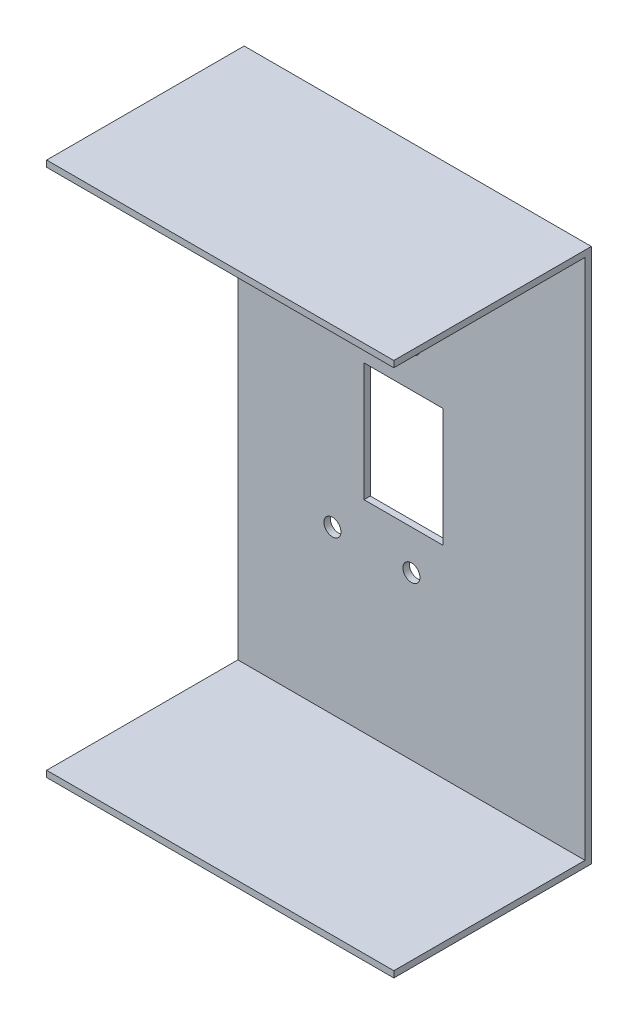
ISO-10303-21;
HEADER;
FILE_DESCRIPTION(('STEP AP214'),'2;1');
FILE_NAME('part.step','',(''),(''),'','','');
FILE_SCHEMA(('AUTOMOTIVE_DESIGN { 1 0 10303 214 1 1 1 1 }'));
ENDSEC;
DATA;
#1=APPLICATION_CONTEXT('core data for automotive mechanical design processes');
#2=APPLICATION_PROTOCOL_DEFINITION('international standard','automotive_design',2000,#1);
#3=PRODUCT_CONTEXT('',#1,'mechanical');
#4=PRODUCT('Part','Part','',(#3));
#5=PRODUCT_RELATED_PRODUCT_CATEGORY('part','',(#4));
#6=PRODUCT_DEFINITION_FORMATION('','',#4);
#7=PRODUCT_DEFINITION_CONTEXT('part definition',#1,'design');
#8=PRODUCT_DEFINITION('design','',#6,#7);
#9=PRODUCT_DEFINITION_SHAPE('','',#8);
#10=(LENGTH_UNIT() NAMED_UNIT(*) SI_UNIT(.MILLI.,.METRE.));
#11=(NAMED_UNIT(*) PLANE_ANGLE_UNIT() SI_UNIT($,.RADIAN.));
#12=(NAMED_UNIT(*) SI_UNIT($,.STERADIAN.) SOLID_ANGLE_UNIT());
#13=UNCERTAINTY_MEASURE_WITH_UNIT(LENGTH_MEASURE(1.E-05),#10,'distance_accuracy_value','');
#14=(GEOMETRIC_REPRESENTATION_CONTEXT(3) GLOBAL_UNCERTAINTY_ASSIGNED_CONTEXT((#13)) GLOBAL_UNIT_ASSIGNED_CONTEXT((#10,
#11,#12)) REPRESENTATION_CONTEXT('',''));
#15=CARTESIAN_POINT('',(0.,0.,0.));
#16=DIRECTION('',(0.,0.,1.));
#17=DIRECTION('',(1.,0.,0.));
#18=AXIS2_PLACEMENT_3D('',#15,#16,#17);
#19=CARTESIAN_POINT('',(87.89068,0.,-50.));
#20=DIRECTION('',(0.,-1.,0.));
#21=DIRECTION('',(0.,0.,-1.));
#22=AXIS2_PLACEMENT_3D('',#19,#20,#21);
#23=PLANE('',#22);
#24=DIRECTION('',(0.,0.,1.));
#25=VECTOR('',#24,1.);
#26=CARTESIAN_POINT('',(0.,0.,-50.));
#27=LINE('',#26,#25);
#28=CARTESIAN_POINT('',(0.,0.,-50.));
#29=VERTEX_POINT('',#28);
#30=CARTESIAN_POINT('',(0.,0.,0.));
#31=VERTEX_POINT('',#30);
#32=EDGE_CURVE('E170',#29,#31,#27,.T.);
#33=ORIENTED_EDGE('',*,*,#32,.T.);
#34=DIRECTION('',(-1.,0.,0.));
#35=VECTOR('',#34,1.);
#36=CARTESIAN_POINT('',(87.89068,0.,0.));
#37=LINE('',#36,#35);
#38=CARTESIAN_POINT('',(87.89068,0.,0.));
#39=VERTEX_POINT('',#38);
#40=EDGE_CURVE('E11',#39,#31,#37,.T.);
#41=ORIENTED_EDGE('',*,*,#40,.F.);
#42=DIRECTION('',(0.,0.,1.));
#43=VECTOR('',#42,1.);
#44=CARTESIAN_POINT('',(87.89068,0.,-50.));
#45=LINE('',#44,#43);
#46=CARTESIAN_POINT('',(87.89068,0.,-50.));
#47=VERTEX_POINT('',#46);
#48=EDGE_CURVE('E172',#47,#39,#45,.T.);
#49=ORIENTED_EDGE('',*,*,#48,.F.);
#50=DIRECTION('',(-1.,0.,0.));
#51=VECTOR('',#50,1.);
#52=CARTESIAN_POINT('',(87.89068,0.,-50.));
#53=LINE('',#52,#51);
#54=EDGE_CURVE('E198',#47,#29,#53,.T.);
#55=ORIENTED_EDGE('',*,*,#54,.T.);
#56=EDGE_LOOP('',(#33,#41,#49,#55));
#57=FACE_BOUND('',#56,.T.);
#58=ADVANCED_FACE('F43',(#57),#23,.F.);
#59=CARTESIAN_POINT('',(87.89068,0.,0.));
#60=DIRECTION('',(0.,0.,-1.));
#61=DIRECTION('',(0.,1.,0.));
#62=AXIS2_PLACEMENT_3D('',#59,#60,#61);
#63=PLANE('',#62);
#64=DIRECTION('',(0.,-1.,0.));
#65=VECTOR('',#64,1.);
#66=CARTESIAN_POINT('',(0.,0.,0.));
#67=LINE('',#66,#65);
#68=CARTESIAN_POINT('',(0.,-1.6002,0.));
#69=VERTEX_POINT('',#68);
#70=EDGE_CURVE('E202',#31,#69,#67,.T.);
#71=ORIENTED_EDGE('',*,*,#70,.T.);
#72=DIRECTION('',(-1.,0.,0.));
#73=VECTOR('',#72,1.);
#74=CARTESIAN_POINT('',(87.89068,-1.6002,0.));
#75=LINE('',#74,#73);
#76=CARTESIAN_POINT('',(87.89068,-1.6002,0.));
#77=VERTEX_POINT('',#76);
#78=EDGE_CURVE('E51',#77,#69,#75,.T.);
#79=ORIENTED_EDGE('',*,*,#78,.F.);
#80=DIRECTION('',(0.,-1.,0.));
#81=VECTOR('',#80,1.);
#82=CARTESIAN_POINT('',(87.89068,0.,0.));
#83=LINE('',#82,#81);
#84=EDGE_CURVE('E176',#39,#77,#83,.T.);
#85=ORIENTED_EDGE('',*,*,#84,.F.);
#86=ORIENTED_EDGE('',*,*,#40,.T.);
#87=EDGE_LOOP('',(#71,#79,#85,#86));
#88=FACE_BOUND('',#87,.T.);
#89=ADVANCED_FACE('F271',(#88),#63,.F.);
#90=CARTESIAN_POINT('',(87.89068,-1.6002,0.));
#91=DIRECTION('',(0.,1.,0.));
#92=DIRECTION('',(0.,0.,1.));
#93=AXIS2_PLACEMENT_3D('',#90,#91,#92);
#94=PLANE('',#93);
#95=DIRECTION('',(0.,0.,-1.));
#96=VECTOR('',#95,1.);
#97=CARTESIAN_POINT('',(0.,-1.6002,0.));
#98=LINE('',#97,#96);
#99=CARTESIAN_POINT('',(0.,-1.6002,-48.3998));
#100=VERTEX_POINT('',#99);
#101=EDGE_CURVE('E205',#69,#100,#98,.T.);
#102=ORIENTED_EDGE('',*,*,#101,.T.);
#103=DIRECTION('',(-1.,0.,0.));
#104=VECTOR('',#103,1.);
#105=CARTESIAN_POINT('',(87.89068,-1.6002,-48.3998));
#106=LINE('',#105,#104);
#107=CARTESIAN_POINT('',(87.89068,-1.6002,-48.3998));
#108=VERTEX_POINT('',#107);
#109=EDGE_CURVE('E241',#108,#100,#106,.T.);
#110=ORIENTED_EDGE('',*,*,#109,.F.);
#111=DIRECTION('',(0.,0.,-1.));
#112=VECTOR('',#111,1.);
#113=CARTESIAN_POINT('',(87.89068,-1.6002,0.));
#114=LINE('',#113,#112);
#115=EDGE_CURVE('E180',#77,#108,#114,.T.);
#116=ORIENTED_EDGE('',*,*,#115,.F.);
#117=ORIENTED_EDGE('',*,*,#78,.T.);
#118=EDGE_LOOP('',(#102,#110,#116,#117));
#119=FACE_BOUND('',#118,.T.);
#120=ADVANCED_FACE('F250',(#119),#94,.F.);
#121=CARTESIAN_POINT('',(87.89068,-1.6002,-48.3998));
#122=DIRECTION('',(0.,0.,-1.));
#123=DIRECTION('',(0.,1.,0.));
#124=AXIS2_PLACEMENT_3D('',#121,#122,#123);
#125=PLANE('',#124);
#126=CARTESIAN_POINT('',(43.94534,-42.69395,-48.3998));
#127=DIRECTION('',(0.,0.,1.));
#128=DIRECTION('',(1.,0.,0.));
#129=AXIS2_PLACEMENT_3D('',#126,#127,#128);
#130=CIRCLE('',#129,2.155);
#131=CARTESIAN_POINT('',(46.10034,-42.69395,-48.3998));
#132=VERTEX_POINT('',#131);
#133=EDGE_CURVE('E309',#132,#132,#130,.T.);
#134=ORIENTED_EDGE('',*,*,#133,.F.);
#135=EDGE_LOOP('',(#134));
#136=FACE_BOUND('',#135,.T.);
#137=CARTESIAN_POINT('',(43.94534,-92.69395,-48.3998));
#138=DIRECTION('',(0.,0.,1.));
#139=DIRECTION('',(1.,0.,0.));
#140=AXIS2_PLACEMENT_3D('',#137,#138,#139);
#141=CIRCLE('',#140,2.15499999999999);
#142=CARTESIAN_POINT('',(46.10034,-92.69395,-48.3998));
#143=VERTEX_POINT('',#142);
#144=EDGE_CURVE('E313',#143,#143,#141,.T.);
#145=ORIENTED_EDGE('',*,*,#144,.F.);
#146=EDGE_LOOP('',(#145));
#147=FACE_BOUND('',#146,.T.);
#148=CARTESIAN_POINT('',(23.94534,-42.69395,-48.3998));
#149=DIRECTION('',(0.,0.,1.));
#150=DIRECTION('',(1.,0.,0.));
#151=AXIS2_PLACEMENT_3D('',#148,#149,#150);
#152=CIRCLE('',#151,2.155);
#153=CARTESIAN_POINT('',(26.10034,-42.69395,-48.3998));
#154=VERTEX_POINT('',#153);
#155=EDGE_CURVE('E317',#154,#154,#152,.T.);
#156=ORIENTED_EDGE('',*,*,#155,.F.);
#157=EDGE_LOOP('',(#156));
#158=FACE_BOUND('',#157,.T.);
#159=CARTESIAN_POINT('',(23.94534,-92.69395,-48.3998));
#160=DIRECTION('',(0.,0.,1.));
#161=DIRECTION('',(1.,0.,0.));
#162=AXIS2_PLACEMENT_3D('',#159,#160,#161);
#163=CIRCLE('',#162,2.15499999999999);
#164=CARTESIAN_POINT('',(26.10034,-92.69395,-48.3998));
#165=VERTEX_POINT('',#164);
#166=EDGE_CURVE('E320',#165,#165,#163,.T.);
#167=ORIENTED_EDGE('',*,*,#166,.F.);
#168=EDGE_LOOP('',(#167));
#169=FACE_BOUND('',#168,.T.);
#170=DIRECTION('',(1.,0.,0.));
#171=VECTOR('',#170,1.);
#172=CARTESIAN_POINT('',(31.94534,-82.69395,-48.3998));
#173=LINE('',#172,#171);
#174=CARTESIAN_POINT('',(31.94534,-82.69395,-48.3998));
#175=VERTEX_POINT('',#174);
#176=CARTESIAN_POINT('',(51.94534,-82.69395,-48.3998));
#177=VERTEX_POINT('',#176);
#178=EDGE_CURVE('E145',#175,#177,#173,.T.);
#179=ORIENTED_EDGE('',*,*,#178,.F.);
#180=DIRECTION('',(0.,-1.,0.));
#181=VECTOR('',#180,1.);
#182=CARTESIAN_POINT('',(31.94534,-82.69395,-48.3998));
#183=LINE('',#182,#181);
#184=CARTESIAN_POINT('',(31.94534,-52.69395,-48.3998));
#185=VERTEX_POINT('',#184);
#186=EDGE_CURVE('E58',#185,#175,#183,.T.);
#187=ORIENTED_EDGE('',*,*,#186,.F.);
#188=DIRECTION('',(-1.,0.,0.));
#189=VECTOR('',#188,1.);
#190=CARTESIAN_POINT('',(31.94534,-52.69395,-48.3998));
#191=LINE('',#190,#189);
#192=CARTESIAN_POINT('',(51.94534,-52.69395,-48.3998));
#193=VERTEX_POINT('',#192);
#194=EDGE_CURVE('E153',#193,#185,#191,.T.);
#195=ORIENTED_EDGE('',*,*,#194,.F.);
#196=DIRECTION('',(0.,1.,0.));
#197=VECTOR('',#196,1.);
#198=CARTESIAN_POINT('',(51.94534,-82.69395,-48.3998));
#199=LINE('',#198,#197);
#200=EDGE_CURVE('E135',#177,#193,#199,.T.);
#201=ORIENTED_EDGE('',*,*,#200,.F.);
#202=EDGE_LOOP('',(#179,#187,#195,#201));
#203=FACE_BOUND('',#202,.T.);
#204=DIRECTION('',(0.,-1.,0.));
#205=VECTOR('',#204,1.);
#206=CARTESIAN_POINT('',(0.,-1.6002,-48.3998));
#207=LINE('',#206,#205);
#208=CARTESIAN_POINT('',(0.,-133.7877,-48.3998));
#209=VERTEX_POINT('',#208);
#210=EDGE_CURVE('E208',#100,#209,#207,.T.);
#211=ORIENTED_EDGE('',*,*,#210,.T.);
#212=DIRECTION('',(-1.,0.,0.));
#213=VECTOR('',#212,1.);
#214=CARTESIAN_POINT('',(87.89068,-133.7877,-48.3998));
#215=LINE('',#214,#213);
#216=CARTESIAN_POINT('',(87.89068,-133.7877,-48.3998));
#217=VERTEX_POINT('',#216);
#218=EDGE_CURVE('E237',#217,#209,#215,.T.);
#219=ORIENTED_EDGE('',*,*,#218,.F.);
#220=DIRECTION('',(0.,-1.,0.));
#221=VECTOR('',#220,1.);
#222=CARTESIAN_POINT('',(87.89068,-1.6002,-48.3998));
#223=LINE('',#222,#221);
#224=EDGE_CURVE('E183',#108,#217,#223,.T.);
#225=ORIENTED_EDGE('',*,*,#224,.F.);
#226=ORIENTED_EDGE('',*,*,#109,.T.);
#227=EDGE_LOOP('',(#211,#219,#225,#226));
#228=FACE_BOUND('',#227,.T.);
#229=ADVANCED_FACE('F150',(#136,#147,#158,#169,#203,#228),#125,.F.);
#230=CARTESIAN_POINT('',(87.89068,-133.7877,-48.3998));
#231=DIRECTION('',(0.,-1.,0.));
#232=DIRECTION('',(0.,0.,-1.));
#233=AXIS2_PLACEMENT_3D('',#230,#231,#232);
#234=PLANE('',#233);
#235=DIRECTION('',(0.,0.,1.));
#236=VECTOR('',#235,1.);
#237=CARTESIAN_POINT('',(0.,-133.7877,-48.3998));
#238=LINE('',#237,#236);
#239=CARTESIAN_POINT('',(0.,-133.7877,0.));
#240=VERTEX_POINT('',#239);
#241=EDGE_CURVE('E211',#209,#240,#238,.T.);
#242=ORIENTED_EDGE('',*,*,#241,.T.);
#243=DIRECTION('',(-1.,0.,0.));
#244=VECTOR('',#243,1.);
#245=CARTESIAN_POINT('',(87.89068,-133.7877,0.));
#246=LINE('',#245,#244);
#247=CARTESIAN_POINT('',(87.89068,-133.7877,0.));
#248=VERTEX_POINT('',#247);
#249=EDGE_CURVE('E233',#248,#240,#246,.T.);
#250=ORIENTED_EDGE('',*,*,#249,.F.);
#251=DIRECTION('',(0.,0.,1.));
#252=VECTOR('',#251,1.);
#253=CARTESIAN_POINT('',(87.89068,-133.7877,-48.3998));
#254=LINE('',#253,#252);
#255=EDGE_CURVE('E186',#217,#248,#254,.T.);
#256=ORIENTED_EDGE('',*,*,#255,.F.);
#257=ORIENTED_EDGE('',*,*,#218,.T.);
#258=EDGE_LOOP('',(#242,#250,#256,#257));
#259=FACE_BOUND('',#258,.T.);
#260=ADVANCED_FACE('F263',(#259),#234,.F.);
#261=CARTESIAN_POINT('',(87.89068,-133.7877,0.));
#262=DIRECTION('',(0.,0.,-1.));
#263=DIRECTION('',(0.,1.,0.));
#264=AXIS2_PLACEMENT_3D('',#261,#262,#263);
#265=PLANE('',#264);
#266=DIRECTION('',(0.,-1.,0.));
#267=VECTOR('',#266,1.);
#268=CARTESIAN_POINT('',(0.,-133.7877,0.));
#269=LINE('',#268,#267);
#270=CARTESIAN_POINT('',(0.,-135.3879,0.));
#271=VERTEX_POINT('',#270);
#272=EDGE_CURVE('E214',#240,#271,#269,.T.);
#273=ORIENTED_EDGE('',*,*,#272,.T.);
#274=DIRECTION('',(-1.,0.,0.));
#275=VECTOR('',#274,1.);
#276=CARTESIAN_POINT('',(87.89068,-135.3879,0.));
#277=LINE('',#276,#275);
#278=CARTESIAN_POINT('',(87.89068,-135.3879,0.));
#279=VERTEX_POINT('',#278);
#280=EDGE_CURVE('E229',#279,#271,#277,.T.);
#281=ORIENTED_EDGE('',*,*,#280,.F.);
#282=DIRECTION('',(0.,-1.,0.));
#283=VECTOR('',#282,1.);
#284=CARTESIAN_POINT('',(87.89068,-133.7877,0.));
#285=LINE('',#284,#283);
#286=EDGE_CURVE('E189',#248,#279,#285,.T.);
#287=ORIENTED_EDGE('',*,*,#286,.F.);
#288=ORIENTED_EDGE('',*,*,#249,.T.);
#289=EDGE_LOOP('',(#273,#281,#287,#288));
#290=FACE_BOUND('',#289,.T.);
#291=ADVANCED_FACE('F284',(#290),#265,.F.);
#292=CARTESIAN_POINT('',(87.89068,-135.3879,0.));
#293=DIRECTION('',(0.,1.,0.));
#294=DIRECTION('',(0.,0.,1.));
#295=AXIS2_PLACEMENT_3D('',#292,#293,#294);
#296=PLANE('',#295);
#297=DIRECTION('',(0.,0.,-1.));
#298=VECTOR('',#297,1.);
#299=CARTESIAN_POINT('',(0.,-135.3879,0.));
#300=LINE('',#299,#298);
#301=CARTESIAN_POINT('',(0.,-135.3879,-50.));
#302=VERTEX_POINT('',#301);
#303=EDGE_CURVE('E217',#271,#302,#300,.T.);
#304=ORIENTED_EDGE('',*,*,#303,.T.);
#305=DIRECTION('',(-1.,0.,0.));
#306=VECTOR('',#305,1.);
#307=CARTESIAN_POINT('',(87.89068,-135.3879,-50.));
#308=LINE('',#307,#306);
#309=CARTESIAN_POINT('',(87.89068,-135.3879,-50.));
#310=VERTEX_POINT('',#309);
#311=EDGE_CURVE('E225',#310,#302,#308,.T.);
#312=ORIENTED_EDGE('',*,*,#311,.F.);
#313=DIRECTION('',(0.,0.,-1.));
#314=VECTOR('',#313,1.);
#315=CARTESIAN_POINT('',(87.89068,-135.3879,0.));
#316=LINE('',#315,#314);
#317=EDGE_CURVE('E192',#279,#310,#316,.T.);
#318=ORIENTED_EDGE('',*,*,#317,.F.);
#319=ORIENTED_EDGE('',*,*,#280,.T.);
#320=EDGE_LOOP('',(#304,#312,#318,#319));
#321=FACE_BOUND('',#320,.T.);
#322=ADVANCED_FACE('F282',(#321),#296,.F.);
#323=CARTESIAN_POINT('',(87.89068,-135.3879,-50.));
#324=DIRECTION('',(0.,0.,1.));
#325=DIRECTION('',(1.,0.,0.));
#326=AXIS2_PLACEMENT_3D('',#323,#324,#325);
#327=PLANE('',#326);
#328=CARTESIAN_POINT('',(43.94534,-42.69395,-50.));
#329=DIRECTION('',(0.,0.,1.));
#330=DIRECTION('',(1.,0.,0.));
#331=AXIS2_PLACEMENT_3D('',#328,#329,#330);
#332=CIRCLE('',#331,2.155);
#333=CARTESIAN_POINT('',(46.10034,-42.69395,-50.));
#334=VERTEX_POINT('',#333);
#335=EDGE_CURVE('E342',#334,#334,#332,.F.);
#336=ORIENTED_EDGE('',*,*,#335,.F.);
#337=EDGE_LOOP('',(#336));
#338=FACE_BOUND('',#337,.T.);
#339=CARTESIAN_POINT('',(43.94534,-92.69395,-50.));
#340=DIRECTION('',(0.,0.,1.));
#341=DIRECTION('',(1.,0.,0.));
#342=AXIS2_PLACEMENT_3D('',#339,#340,#341);
#343=CIRCLE('',#342,2.15499999999999);
#344=CARTESIAN_POINT('',(46.10034,-92.69395,-50.));
#345=VERTEX_POINT('',#344);
#346=EDGE_CURVE('E336',#345,#345,#343,.F.);
#347=ORIENTED_EDGE('',*,*,#346,.F.);
#348=EDGE_LOOP('',(#347));
#349=FACE_BOUND('',#348,.T.);
#350=CARTESIAN_POINT('',(23.94534,-42.69395,-50.));
#351=DIRECTION('',(0.,0.,1.));
#352=DIRECTION('',(1.,0.,0.));
#353=AXIS2_PLACEMENT_3D('',#350,#351,#352);
#354=CIRCLE('',#353,2.155);
#355=CARTESIAN_POINT('',(26.10034,-42.69395,-50.));
#356=VERTEX_POINT('',#355);
#357=EDGE_CURVE('E330',#356,#356,#354,.F.);
#358=ORIENTED_EDGE('',*,*,#357,.F.);
#359=EDGE_LOOP('',(#358));
#360=FACE_BOUND('',#359,.T.);
#361=CARTESIAN_POINT('',(23.94534,-92.69395,-50.));
#362=DIRECTION('',(0.,0.,1.));
#363=DIRECTION('',(1.,0.,0.));
#364=AXIS2_PLACEMENT_3D('',#361,#362,#363);
#365=CIRCLE('',#364,2.15499999999999);
#366=CARTESIAN_POINT('',(26.10034,-92.69395,-50.));
#367=VERTEX_POINT('',#366);
#368=EDGE_CURVE('E323',#367,#367,#365,.F.);
#369=ORIENTED_EDGE('',*,*,#368,.F.);
#370=EDGE_LOOP('',(#369));
#371=FACE_BOUND('',#370,.T.);
#372=DIRECTION('',(1.,0.,0.));
#373=VECTOR('',#372,1.);
#374=CARTESIAN_POINT('',(31.94534,-52.69395,-50.));
#375=LINE('',#374,#373);
#376=CARTESIAN_POINT('',(31.94534,-52.69395,-50.));
#377=VERTEX_POINT('',#376);
#378=CARTESIAN_POINT('',(51.94534,-52.69395,-50.));
#379=VERTEX_POINT('',#378);
#380=EDGE_CURVE('E350',#377,#379,#375,.T.);
#381=ORIENTED_EDGE('',*,*,#380,.F.);
#382=DIRECTION('',(0.,1.,0.));
#383=VECTOR('',#382,1.);
#384=CARTESIAN_POINT('',(31.94534,-82.69395,-50.));
#385=LINE('',#384,#383);
#386=CARTESIAN_POINT('',(31.94534,-82.69395,-50.));
#387=VERTEX_POINT('',#386);
#388=EDGE_CURVE('E171',#387,#377,#385,.T.);
#389=ORIENTED_EDGE('',*,*,#388,.F.);
#390=DIRECTION('',(-1.,0.,0.));
#391=VECTOR('',#390,1.);
#392=CARTESIAN_POINT('',(31.94534,-82.69395,-50.));
#393=LINE('',#392,#391);
#394=CARTESIAN_POINT('',(51.94534,-82.69395,-50.));
#395=VERTEX_POINT('',#394);
#396=EDGE_CURVE('E167',#395,#387,#393,.T.);
#397=ORIENTED_EDGE('',*,*,#396,.F.);
#398=DIRECTION('',(0.,-1.,0.));
#399=VECTOR('',#398,1.);
#400=CARTESIAN_POINT('',(51.94534,-82.69395,-50.));
#401=LINE('',#400,#399);
#402=EDGE_CURVE('E138',#379,#395,#401,.T.);
#403=ORIENTED_EDGE('',*,*,#402,.F.);
#404=EDGE_LOOP('',(#381,#389,#397,#403));
#405=FACE_BOUND('',#404,.T.);
#406=DIRECTION('',(0.,1.,0.));
#407=VECTOR('',#406,1.);
#408=CARTESIAN_POINT('',(0.,-135.3879,-50.));
#409=LINE('',#408,#407);
#410=EDGE_CURVE('E177',#302,#29,#409,.T.);
#411=ORIENTED_EDGE('',*,*,#410,.T.);
#412=ORIENTED_EDGE('',*,*,#54,.F.);
#413=DIRECTION('',(0.,1.,0.));
#414=VECTOR('',#413,1.);
#415=CARTESIAN_POINT('',(87.89068,-135.3879,-50.));
#416=LINE('',#415,#414);
#417=EDGE_CURVE('E195',#310,#47,#416,.T.);
#418=ORIENTED_EDGE('',*,*,#417,.F.);
#419=ORIENTED_EDGE('',*,*,#311,.T.);
#420=EDGE_LOOP('',(#411,#412,#418,#419));
#421=FACE_BOUND('',#420,.T.);
#422=ADVANCED_FACE('F277',(#338,#349,#360,#371,#405,#421),#327,.F.);
#423=CARTESIAN_POINT('',(87.89068,0.,0.));
#424=DIRECTION('',(1.,0.,0.));
#425=DIRECTION('',(0.,0.,-1.));
#426=AXIS2_PLACEMENT_3D('',#423,#424,#425);
#427=PLANE('',#426);
#428=ORIENTED_EDGE('',*,*,#48,.T.);
#429=ORIENTED_EDGE('',*,*,#84,.T.);
#430=ORIENTED_EDGE('',*,*,#115,.T.);
#431=ORIENTED_EDGE('',*,*,#224,.T.);
#432=ORIENTED_EDGE('',*,*,#255,.T.);
#433=ORIENTED_EDGE('',*,*,#286,.T.);
#434=ORIENTED_EDGE('',*,*,#317,.T.);
#435=ORIENTED_EDGE('',*,*,#417,.T.);
#436=EDGE_LOOP('',(#428,#429,#430,#431,#432,#433,#434,#435));
#437=FACE_BOUND('',#436,.T.);
#438=ADVANCED_FACE('F267',(#437),#427,.T.);
#439=CARTESIAN_POINT('',(0.,0.,0.));
#440=DIRECTION('',(1.,0.,0.));
#441=DIRECTION('',(0.,0.,-1.));
#442=AXIS2_PLACEMENT_3D('',#439,#440,#441);
#443=PLANE('',#442);
#444=ORIENTED_EDGE('',*,*,#32,.F.);
#445=ORIENTED_EDGE('',*,*,#410,.F.);
#446=ORIENTED_EDGE('',*,*,#303,.F.);
#447=ORIENTED_EDGE('',*,*,#272,.F.);
#448=ORIENTED_EDGE('',*,*,#241,.F.);
#449=ORIENTED_EDGE('',*,*,#210,.F.);
#450=ORIENTED_EDGE('',*,*,#101,.F.);
#451=ORIENTED_EDGE('',*,*,#70,.F.);
#452=EDGE_LOOP('',(#444,#445,#446,#447,#448,#449,#450,#451));
#453=FACE_BOUND('',#452,.T.);
#454=ADVANCED_FACE('F256',(#453),#443,.F.);
#455=CARTESIAN_POINT('',(31.94534,-82.69395,-86.0555127546399));
#456=DIRECTION('',(-1.,0.,0.));
#457=DIRECTION('',(0.,0.,1.));
#458=AXIS2_PLACEMENT_3D('',#455,#456,#457);
#459=PLANE('',#458);
#460=ORIENTED_EDGE('',*,*,#388,.T.);
#461=DIRECTION('',(0.,0.,1.));
#462=VECTOR('',#461,1.);
#463=CARTESIAN_POINT('',(31.94534,-52.69395,-86.0555127546399));
#464=LINE('',#463,#462);
#465=EDGE_CURVE('E160',#377,#185,#464,.T.);
#466=ORIENTED_EDGE('',*,*,#465,.T.);
#467=ORIENTED_EDGE('',*,*,#186,.T.);
#468=DIRECTION('',(0.,0.,1.));
#469=VECTOR('',#468,1.);
#470=CARTESIAN_POINT('',(31.94534,-82.69395,-86.0555127546399));
#471=LINE('',#470,#469);
#472=EDGE_CURVE('E142',#387,#175,#471,.T.);
#473=ORIENTED_EDGE('',*,*,#472,.F.);
#474=EDGE_LOOP('',(#460,#466,#467,#473));
#475=FACE_BOUND('',#474,.T.);
#476=ADVANCED_FACE('F356',(#475),#459,.F.);
#477=CARTESIAN_POINT('',(31.94534,-52.69395,-86.0555127546399));
#478=DIRECTION('',(0.,1.,0.));
#479=DIRECTION('',(0.,0.,1.));
#480=AXIS2_PLACEMENT_3D('',#477,#478,#479);
#481=PLANE('',#480);
#482=ORIENTED_EDGE('',*,*,#380,.T.);
#483=DIRECTION('',(0.,0.,1.));
#484=VECTOR('',#483,1.);
#485=CARTESIAN_POINT('',(51.94534,-52.69395,-86.0555127546399));
#486=LINE('',#485,#484);
#487=EDGE_CURVE('E141',#379,#193,#486,.T.);
#488=ORIENTED_EDGE('',*,*,#487,.T.);
#489=ORIENTED_EDGE('',*,*,#194,.T.);
#490=ORIENTED_EDGE('',*,*,#465,.F.);
#491=EDGE_LOOP('',(#482,#488,#489,#490));
#492=FACE_BOUND('',#491,.T.);
#493=ADVANCED_FACE('F360',(#492),#481,.F.);
#494=CARTESIAN_POINT('',(51.94534,-82.69395,-86.0555127546399));
#495=DIRECTION('',(1.,0.,0.));
#496=DIRECTION('',(0.,0.,-1.));
#497=AXIS2_PLACEMENT_3D('',#494,#495,#496);
#498=PLANE('',#497);
#499=ORIENTED_EDGE('',*,*,#402,.T.);
#500=DIRECTION('',(0.,0.,1.));
#501=VECTOR('',#500,1.);
#502=CARTESIAN_POINT('',(51.94534,-82.69395,-86.0555127546399));
#503=LINE('',#502,#501);
#504=EDGE_CURVE('E66',#395,#177,#503,.T.);
#505=ORIENTED_EDGE('',*,*,#504,.T.);
#506=ORIENTED_EDGE('',*,*,#200,.T.);
#507=ORIENTED_EDGE('',*,*,#487,.F.);
#508=EDGE_LOOP('',(#499,#505,#506,#507));
#509=FACE_BOUND('',#508,.T.);
#510=ADVANCED_FACE('F132',(#509),#498,.F.);
#511=CARTESIAN_POINT('',(31.94534,-82.69395,-86.0555127546399));
#512=DIRECTION('',(0.,-1.,0.));
#513=DIRECTION('',(0.,0.,-1.));
#514=AXIS2_PLACEMENT_3D('',#511,#512,#513);
#515=PLANE('',#514);
#516=ORIENTED_EDGE('',*,*,#396,.T.);
#517=ORIENTED_EDGE('',*,*,#472,.T.);
#518=ORIENTED_EDGE('',*,*,#178,.T.);
#519=ORIENTED_EDGE('',*,*,#504,.F.);
#520=EDGE_LOOP('',(#516,#517,#518,#519));
#521=FACE_BOUND('',#520,.T.);
#522=ADVANCED_FACE('F146',(#521),#515,.F.);
#523=CARTESIAN_POINT('',(23.94534,-92.69395,-86.0555127546399));
#524=DIRECTION('',(0.,0.,1.));
#525=DIRECTION('',(1.,0.,0.));
#526=AXIS2_PLACEMENT_3D('',#523,#524,#525);
#527=CYLINDRICAL_SURFACE('',#526,2.15499999999999);
#528=ORIENTED_EDGE('',*,*,#368,.T.);
#529=EDGE_LOOP('',(#528));
#530=FACE_BOUND('',#529,.T.);
#531=ORIENTED_EDGE('',*,*,#166,.T.);
#532=EDGE_LOOP('',(#531));
#533=FACE_BOUND('',#532,.T.);
#534=ADVANCED_FACE('F377',(#530,#533),#527,.F.);
#535=CARTESIAN_POINT('',(23.94534,-42.69395,-86.0555127546399));
#536=DIRECTION('',(0.,0.,1.));
#537=DIRECTION('',(1.,0.,0.));
#538=AXIS2_PLACEMENT_3D('',#535,#536,#537);
#539=CYLINDRICAL_SURFACE('',#538,2.155);
#540=ORIENTED_EDGE('',*,*,#357,.T.);
#541=EDGE_LOOP('',(#540));
#542=FACE_BOUND('',#541,.T.);
#543=ORIENTED_EDGE('',*,*,#155,.T.);
#544=EDGE_LOOP('',(#543));
#545=FACE_BOUND('',#544,.T.);
#546=ADVANCED_FACE('F389',(#542,#545),#539,.F.);
#547=CARTESIAN_POINT('',(43.94534,-92.69395,-86.0555127546399));
#548=DIRECTION('',(0.,0.,1.));
#549=DIRECTION('',(1.,0.,0.));
#550=AXIS2_PLACEMENT_3D('',#547,#548,#549);
#551=CYLINDRICAL_SURFACE('',#550,2.15499999999999);
#552=ORIENTED_EDGE('',*,*,#346,.T.);
#553=EDGE_LOOP('',(#552));
#554=FACE_BOUND('',#553,.T.);
#555=ORIENTED_EDGE('',*,*,#144,.T.);
#556=EDGE_LOOP('',(#555));
#557=FACE_BOUND('',#556,.T.);
#558=ADVANCED_FACE('F385',(#554,#557),#551,.F.);
#559=CARTESIAN_POINT('',(43.94534,-42.69395,-86.0555127546399));
#560=DIRECTION('',(0.,0.,1.));
#561=DIRECTION('',(1.,0.,0.));
#562=AXIS2_PLACEMENT_3D('',#559,#560,#561);
#563=CYLINDRICAL_SURFACE('',#562,2.155);
#564=ORIENTED_EDGE('',*,*,#335,.T.);
#565=EDGE_LOOP('',(#564));
#566=FACE_BOUND('',#565,.T.);
#567=ORIENTED_EDGE('',*,*,#133,.T.);
#568=EDGE_LOOP('',(#567));
#569=FACE_BOUND('',#568,.T.);
#570=ADVANCED_FACE('F382',(#566,#569),#563,.F.);
#571=CLOSED_SHELL('',(#58,#89,#120,#229,#260,#291,#322,#422,#438,#454,#476,#493,#510,#522,#534,
#546,#558,#570));
#572=MANIFOLD_SOLID_BREP('B2',#571);
#573=ADVANCED_BREP_SHAPE_REPRESENTATION('',(#18,#572),#14);
#574=SHAPE_DEFINITION_REPRESENTATION(#9,#573);
ENDSEC;
END-ISO-10303-21;
